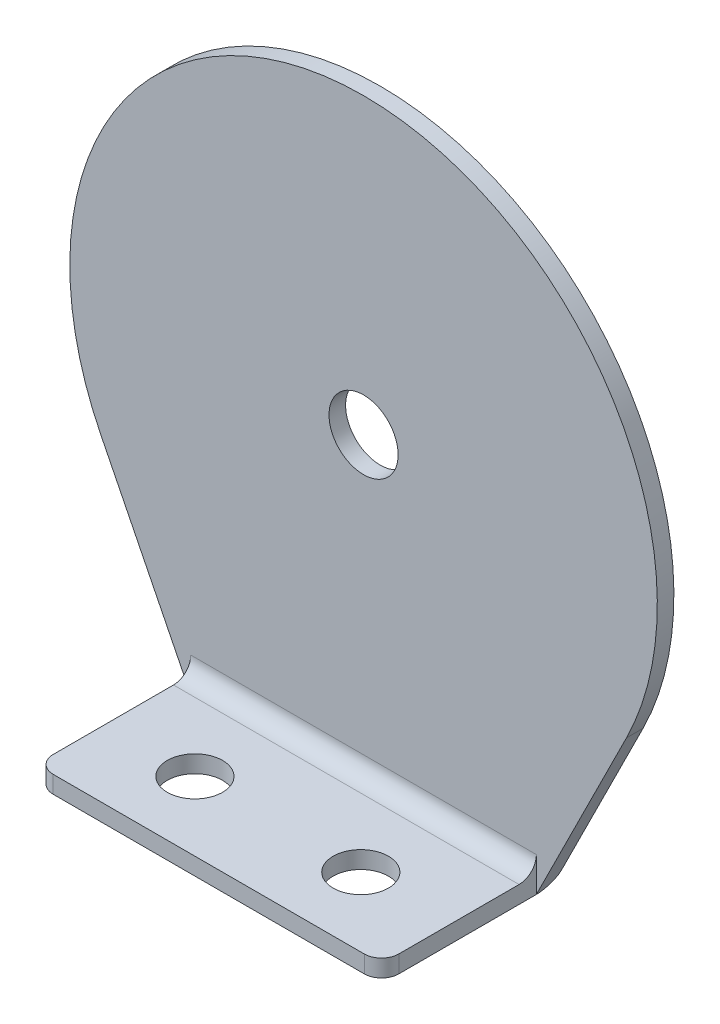
ISO-10303-21;
HEADER;
FILE_DESCRIPTION(('STEP AP214'),'2;1');
FILE_NAME('part.step','',(''),(''),'','','');
FILE_SCHEMA(('AUTOMOTIVE_DESIGN { 1 0 10303 214 1 1 1 1 }'));
ENDSEC;
DATA;
#1=APPLICATION_CONTEXT('core data for automotive mechanical design processes');
#2=APPLICATION_PROTOCOL_DEFINITION('international standard','automotive_design',2000,#1);
#3=PRODUCT_CONTEXT('',#1,'mechanical');
#4=PRODUCT('Part','Part','',(#3));
#5=PRODUCT_RELATED_PRODUCT_CATEGORY('part','',(#4));
#6=PRODUCT_DEFINITION_FORMATION('','',#4);
#7=PRODUCT_DEFINITION_CONTEXT('part definition',#1,'design');
#8=PRODUCT_DEFINITION('design','',#6,#7);
#9=PRODUCT_DEFINITION_SHAPE('','',#8);
#10=(LENGTH_UNIT() NAMED_UNIT(*) SI_UNIT(.MILLI.,.METRE.));
#11=(NAMED_UNIT(*) PLANE_ANGLE_UNIT() SI_UNIT($,.RADIAN.));
#12=(NAMED_UNIT(*) SI_UNIT($,.STERADIAN.) SOLID_ANGLE_UNIT());
#13=UNCERTAINTY_MEASURE_WITH_UNIT(LENGTH_MEASURE(1.E-05),#10,'distance_accuracy_value','');
#14=(GEOMETRIC_REPRESENTATION_CONTEXT(3) GLOBAL_UNCERTAINTY_ASSIGNED_CONTEXT((#13)) GLOBAL_UNIT_ASSIGNED_CONTEXT((#10,
#11,#12)) REPRESENTATION_CONTEXT('',''));
#15=CARTESIAN_POINT('',(0.,0.,0.));
#16=DIRECTION('',(0.,0.,1.));
#17=DIRECTION('',(1.,0.,0.));
#18=AXIS2_PLACEMENT_3D('',#15,#16,#17);
#19=CARTESIAN_POINT('',(0.,28.6385,1.524));
#20=DIRECTION('',(0.,0.,-1.));
#21=DIRECTION('',(-1.,0.,0.));
#22=AXIS2_PLACEMENT_3D('',#19,#20,#21);
#23=CYLINDRICAL_SURFACE('',#22,26.9875);
#24=CARTESIAN_POINT('',(0.,28.6385,0.));
#25=DIRECTION('',(0.,0.,1.));
#26=DIRECTION('',(1.,0.,0.));
#27=AXIS2_PLACEMENT_3D('',#24,#25,#26);
#28=CIRCLE('',#27,26.9875);
#29=CARTESIAN_POINT('',(24.1507546518845,16.5941566806455,0.));
#30=VERTEX_POINT('',#29);
#31=CARTESIAN_POINT('',(-24.1507546518845,16.5941566806455,0.));
#32=VERTEX_POINT('',#31);
#33=EDGE_CURVE('E155',#30,#32,#28,.T.);
#34=ORIENTED_EDGE('',*,*,#33,.T.);
#35=DIRECTION('',(0.,0.,-1.));
#36=VECTOR('',#35,1.);
#37=CARTESIAN_POINT('',(-24.1507546518845,16.5941566806455,1.524));
#38=LINE('',#37,#36);
#39=CARTESIAN_POINT('',(-24.1507546518845,16.5941566806455,1.524));
#40=VERTEX_POINT('',#39);
#41=EDGE_CURVE('E135',#40,#32,#38,.T.);
#42=ORIENTED_EDGE('',*,*,#41,.F.);
#43=CARTESIAN_POINT('',(0.,28.6385,1.524));
#44=DIRECTION('',(0.,0.,1.));
#45=DIRECTION('',(1.,0.,0.));
#46=AXIS2_PLACEMENT_3D('',#43,#44,#45);
#47=CIRCLE('',#46,26.9875);
#48=CARTESIAN_POINT('',(24.1507546518845,16.5941566806455,1.524));
#49=VERTEX_POINT('',#48);
#50=EDGE_CURVE('E143',#49,#40,#47,.T.);
#51=ORIENTED_EDGE('',*,*,#50,.F.);
#52=DIRECTION('',(0.,0.,-1.));
#53=VECTOR('',#52,1.);
#54=CARTESIAN_POINT('',(24.1507546518845,16.5941566806455,1.524));
#55=LINE('',#54,#53);
#56=EDGE_CURVE('E158',#49,#30,#55,.T.);
#57=ORIENTED_EDGE('',*,*,#56,.T.);
#58=EDGE_LOOP('',(#34,#42,#51,#57));
#59=FACE_BOUND('',#58,.T.);
#60=ADVANCED_FACE('F39',(#59),#23,.T.);
#61=CARTESIAN_POINT('',(-24.1507546518845,16.5941566806455,1.524));
#62=DIRECTION('',(0.894886693909569,0.446293406923743,0.));
#63=DIRECTION('',(-0.446293406923743,0.894886693909569,0.));
#64=AXIS2_PLACEMENT_3D('',#61,#62,#63);
#65=PLANE('',#64);
#66=DIRECTION('',(0.446293406923743,-0.894886693909569,0.));
#67=VECTOR('',#66,1.);
#68=CARTESIAN_POINT('',(-24.1507546518845,16.5941566806455,0.));
#69=LINE('',#68,#67);
#70=CARTESIAN_POINT('',(-16.6667100436438,1.5875,0.));
#71=VERTEX_POINT('',#70);
#72=EDGE_CURVE('E282',#32,#71,#69,.T.);
#73=ORIENTED_EDGE('',*,*,#72,.T.);
#74=CARTESIAN_POINT('',(-16.6667100436438,1.5875,1.5875));
#75=DIRECTION('',(0.894886693909569,0.446293406923743,0.));
#76=DIRECTION('',(0.446293406923743,-0.894886693909569,0.));
#77=AXIS2_PLACEMENT_3D('',#74,#75,#76);
#78=ELLIPSE('',#77,1.773967599255,1.5875);
#79=CARTESIAN_POINT('',(-15.875633621585,0.00127050840680737,1.524));
#80=VERTEX_POINT('',#79);
#81=EDGE_CURVE('E138',#71,#80,#78,.F.);
#82=ORIENTED_EDGE('',*,*,#81,.T.);
#83=DIRECTION('',(0.446293406923743,-0.894886693909569,0.));
#84=VECTOR('',#83,1.);
#85=CARTESIAN_POINT('',(-24.1507546518845,16.5941566806455,1.524));
#86=LINE('',#85,#84);
#87=EDGE_CURVE('E131',#40,#80,#86,.T.);
#88=ORIENTED_EDGE('',*,*,#87,.F.);
#89=ORIENTED_EDGE('',*,*,#41,.T.);
#90=EDGE_LOOP('',(#73,#82,#88,#89));
#91=FACE_BOUND('',#90,.T.);
#92=ADVANCED_FACE('F133',(#91),#65,.F.);
#93=CARTESIAN_POINT('',(-15.875,0.,1.524));
#94=DIRECTION('',(0.,1.,0.));
#95=DIRECTION('',(0.,0.,1.));
#96=AXIS2_PLACEMENT_3D('',#93,#94,#95);
#97=PLANE('',#96);
#98=CARTESIAN_POINT('',(7.62,0.,9.398));
#99=DIRECTION('',(0.,-1.,0.));
#100=DIRECTION('',(0.,0.,-1.));
#101=AXIS2_PLACEMENT_3D('',#98,#99,#100);
#102=CIRCLE('',#101,2.54);
#103=CARTESIAN_POINT('',(7.62,0.,6.858));
#104=VERTEX_POINT('',#103);
#105=EDGE_CURVE('E224',#104,#104,#102,.T.);
#106=ORIENTED_EDGE('',*,*,#105,.F.);
#107=EDGE_LOOP('',(#106));
#108=FACE_BOUND('',#107,.T.);
#109=CARTESIAN_POINT('',(-7.62,0.,9.398));
#110=DIRECTION('',(0.,-1.,0.));
#111=DIRECTION('',(0.,0.,1.));
#112=AXIS2_PLACEMENT_3D('',#109,#110,#111);
#113=CIRCLE('',#112,2.54);
#114=CARTESIAN_POINT('',(-7.62,0.,11.938));
#115=VERTEX_POINT('',#114);
#116=EDGE_CURVE('E232',#115,#115,#113,.T.);
#117=ORIENTED_EDGE('',*,*,#116,.F.);
#118=EDGE_LOOP('',(#117));
#119=FACE_BOUND('',#118,.T.);
#120=DIRECTION('',(1.,0.,0.));
#121=VECTOR('',#120,1.);
#122=CARTESIAN_POINT('',(-15.875,0.,15.748));
#123=LINE('',#122,#121);
#124=CARTESIAN_POINT('',(-14.2875,0.,15.748));
#125=VERTEX_POINT('',#124);
#126=CARTESIAN_POINT('',(14.2875,0.,15.748));
#127=VERTEX_POINT('',#126);
#128=EDGE_CURVE('E240',#125,#127,#123,.T.);
#129=ORIENTED_EDGE('',*,*,#128,.F.);
#130=CARTESIAN_POINT('',(-14.2875,0.,14.1605));
#131=DIRECTION('',(0.,1.,0.));
#132=DIRECTION('',(0.,0.,1.));
#133=AXIS2_PLACEMENT_3D('',#130,#131,#132);
#134=CIRCLE('',#133,1.5875);
#135=CARTESIAN_POINT('',(-15.875,0.,14.1605));
#136=VERTEX_POINT('',#135);
#137=EDGE_CURVE('E178',#125,#136,#134,.F.);
#138=ORIENTED_EDGE('',*,*,#137,.T.);
#139=DIRECTION('',(0.,0.,-1.));
#140=VECTOR('',#139,1.);
#141=CARTESIAN_POINT('',(-15.875,0.,15.748));
#142=LINE('',#141,#140);
#143=CARTESIAN_POINT('',(-15.875,0.,1.5875));
#144=VERTEX_POINT('',#143);
#145=EDGE_CURVE('E266',#136,#144,#142,.T.);
#146=ORIENTED_EDGE('',*,*,#145,.T.);
#147=DIRECTION('',(1.,0.,0.));
#148=VECTOR('',#147,1.);
#149=CARTESIAN_POINT('',(-15.875,0.,1.5875));
#150=LINE('',#149,#148);
#151=CARTESIAN_POINT('',(15.875,0.,1.5875));
#152=VERTEX_POINT('',#151);
#153=EDGE_CURVE('E171',#144,#152,#150,.T.);
#154=ORIENTED_EDGE('',*,*,#153,.T.);
#155=DIRECTION('',(0.,0.,-1.));
#156=VECTOR('',#155,1.);
#157=CARTESIAN_POINT('',(15.875,0.,15.748));
#158=LINE('',#157,#156);
#159=CARTESIAN_POINT('',(15.875,0.,14.1605));
#160=VERTEX_POINT('',#159);
#161=EDGE_CURVE('E262',#160,#152,#158,.T.);
#162=ORIENTED_EDGE('',*,*,#161,.F.);
#163=CARTESIAN_POINT('',(14.2875,0.,14.1605));
#164=DIRECTION('',(0.,1.,0.));
#165=DIRECTION('',(0.,0.,1.));
#166=AXIS2_PLACEMENT_3D('',#163,#164,#165);
#167=CIRCLE('',#166,1.5875);
#168=EDGE_CURVE('E175',#160,#127,#167,.F.);
#169=ORIENTED_EDGE('',*,*,#168,.T.);
#170=EDGE_LOOP('',(#129,#138,#146,#154,#162,#169));
#171=FACE_BOUND('',#170,.T.);
#172=ADVANCED_FACE('F305',(#108,#119,#171),#97,.F.);
#173=CARTESIAN_POINT('',(24.1507546518845,16.5941566806455,1.524));
#174=DIRECTION('',(-0.894886693909569,0.446293406923743,0.));
#175=DIRECTION('',(-0.446293406923743,-0.894886693909569,0.));
#176=AXIS2_PLACEMENT_3D('',#173,#174,#175);
#177=PLANE('',#176);
#178=DIRECTION('',(0.446293406923743,0.894886693909569,0.));
#179=VECTOR('',#178,1.);
#180=CARTESIAN_POINT('',(24.1507546518845,16.5941566806455,1.524));
#181=LINE('',#180,#179);
#182=CARTESIAN_POINT('',(15.875633621585,0.00127050840680737,1.524));
#183=VERTEX_POINT('',#182);
#184=EDGE_CURVE('E142',#183,#49,#181,.T.);
#185=ORIENTED_EDGE('',*,*,#184,.F.);
#186=CARTESIAN_POINT('',(16.6667100436438,1.5875,1.5875));
#187=DIRECTION('',(-0.894886693909569,0.446293406923743,0.));
#188=DIRECTION('',(0.446293406923743,0.894886693909569,0.));
#189=AXIS2_PLACEMENT_3D('',#186,#187,#188);
#190=ELLIPSE('',#189,1.773967599255,1.5875);
#191=CARTESIAN_POINT('',(16.6667100436438,1.5875,0.));
#192=VERTEX_POINT('',#191);
#193=EDGE_CURVE('E65',#183,#192,#190,.F.);
#194=ORIENTED_EDGE('',*,*,#193,.T.);
#195=DIRECTION('',(0.446293406923743,0.894886693909569,0.));
#196=VECTOR('',#195,1.);
#197=CARTESIAN_POINT('',(24.1507546518845,16.5941566806455,0.));
#198=LINE('',#197,#196);
#199=EDGE_CURVE('E152',#192,#30,#198,.T.);
#200=ORIENTED_EDGE('',*,*,#199,.T.);
#201=ORIENTED_EDGE('',*,*,#56,.F.);
#202=EDGE_LOOP('',(#185,#194,#200,#201));
#203=FACE_BOUND('',#202,.T.);
#204=ADVANCED_FACE('F285',(#203),#177,.F.);
#205=CARTESIAN_POINT('',(0.,28.6385,1.524));
#206=DIRECTION('',(0.,0.,1.));
#207=DIRECTION('',(1.,0.,0.));
#208=AXIS2_PLACEMENT_3D('',#205,#206,#207);
#209=PLANE('',#208);
#210=DIRECTION('',(0.,-1.,0.));
#211=VECTOR('',#210,1.);
#212=CARTESIAN_POINT('',(-15.875,0.,1.524));
#213=LINE('',#212,#211);
#214=CARTESIAN_POINT('',(-15.875,3.175,1.524));
#215=VERTEX_POINT('',#214);
#216=CARTESIAN_POINT('',(-15.875,0.00127050840680672,1.524));
#217=VERTEX_POINT('',#216);
#218=EDGE_CURVE('E230',#215,#217,#213,.T.);
#219=ORIENTED_EDGE('',*,*,#218,.F.);
#220=DIRECTION('',(-1.,0.,0.));
#221=VECTOR('',#220,1.);
#222=CARTESIAN_POINT('',(0.,3.175,1.524));
#223=LINE('',#222,#221);
#224=CARTESIAN_POINT('',(15.875,3.175,1.524));
#225=VERTEX_POINT('',#224);
#226=EDGE_CURVE('E209',#215,#225,#223,.F.);
#227=ORIENTED_EDGE('',*,*,#226,.T.);
#228=DIRECTION('',(0.,1.,0.));
#229=VECTOR('',#228,1.);
#230=CARTESIAN_POINT('',(15.875,0.,1.524));
#231=LINE('',#230,#229);
#232=CARTESIAN_POINT('',(15.875,0.00127050840680672,1.524));
#233=VERTEX_POINT('',#232);
#234=EDGE_CURVE('E245',#233,#225,#231,.T.);
#235=ORIENTED_EDGE('',*,*,#234,.F.);
#236=DIRECTION('',(1.,0.,0.));
#237=VECTOR('',#236,1.);
#238=CARTESIAN_POINT('',(15.875,0.00127050840680672,1.524));
#239=LINE('',#238,#237);
#240=EDGE_CURVE('E206',#233,#183,#239,.T.);
#241=ORIENTED_EDGE('',*,*,#240,.T.);
#242=ORIENTED_EDGE('',*,*,#184,.T.);
#243=ORIENTED_EDGE('',*,*,#50,.T.);
#244=ORIENTED_EDGE('',*,*,#87,.T.);
#245=DIRECTION('',(1.,0.,0.));
#246=VECTOR('',#245,1.);
#247=CARTESIAN_POINT('',(-15.875633621585,0.00127050840680737,1.524));
#248=LINE('',#247,#246);
#249=EDGE_CURVE('E203',#80,#217,#248,.T.);
#250=ORIENTED_EDGE('',*,*,#249,.T.);
#251=EDGE_LOOP('',(#219,#227,#235,#241,#242,#243,#244,#250));
#252=FACE_BOUND('',#251,.T.);
#253=CARTESIAN_POINT('',(0.,28.6385,1.524));
#254=DIRECTION('',(0.,0.,1.));
#255=DIRECTION('',(1.,0.,0.));
#256=AXIS2_PLACEMENT_3D('',#253,#254,#255);
#257=CIRCLE('',#256,3.175);
#258=CARTESIAN_POINT('',(3.175,28.6385,1.524));
#259=VERTEX_POINT('',#258);
#260=EDGE_CURVE('E270',#259,#259,#257,.T.);
#261=ORIENTED_EDGE('',*,*,#260,.F.);
#262=EDGE_LOOP('',(#261));
#263=FACE_BOUND('',#262,.T.);
#264=ADVANCED_FACE('F146',(#252,#263),#209,.T.);
#265=CARTESIAN_POINT('',(0.,28.6385,0.));
#266=DIRECTION('',(0.,0.,1.));
#267=DIRECTION('',(1.,0.,0.));
#268=AXIS2_PLACEMENT_3D('',#265,#266,#267);
#269=PLANE('',#268);
#270=CARTESIAN_POINT('',(0.,28.6385,0.));
#271=DIRECTION('',(0.,0.,1.));
#272=DIRECTION('',(1.,0.,0.));
#273=AXIS2_PLACEMENT_3D('',#270,#271,#272);
#274=CIRCLE('',#273,3.175);
#275=CARTESIAN_POINT('',(3.175,28.6385,0.));
#276=VERTEX_POINT('',#275);
#277=EDGE_CURVE('E271',#276,#276,#274,.T.);
#278=ORIENTED_EDGE('',*,*,#277,.T.);
#279=EDGE_LOOP('',(#278));
#280=FACE_BOUND('',#279,.T.);
#281=ORIENTED_EDGE('',*,*,#199,.F.);
#282=DIRECTION('',(1.,0.,0.));
#283=VECTOR('',#282,1.);
#284=CARTESIAN_POINT('',(0.,1.5875,0.));
#285=LINE('',#284,#283);
#286=EDGE_CURVE('E57',#192,#71,#285,.F.);
#287=ORIENTED_EDGE('',*,*,#286,.T.);
#288=ORIENTED_EDGE('',*,*,#72,.F.);
#289=ORIENTED_EDGE('',*,*,#33,.F.);
#290=EDGE_LOOP('',(#281,#287,#288,#289));
#291=FACE_BOUND('',#290,.T.);
#292=ADVANCED_FACE('F286',(#280,#291),#269,.F.);
#293=CARTESIAN_POINT('',(0.,28.6385,0.));
#294=DIRECTION('',(0.,0.,1.));
#295=DIRECTION('',(1.,0.,0.));
#296=AXIS2_PLACEMENT_3D('',#293,#294,#295);
#297=CYLINDRICAL_SURFACE('',#296,3.175);
#298=CARTESIAN_POINT('',(3.175,28.6385,0.));
#299=CARTESIAN_POINT('',(3.175,28.6385,0.015875));
#300=CARTESIAN_POINT('',(3.175,28.6385,0.03175));
#301=CARTESIAN_POINT('',(3.175,28.6385,0.0635));
#302=CARTESIAN_POINT('',(3.175,28.6385,0.079375));
#303=CARTESIAN_POINT('',(3.175,28.6385,0.111125));
#304=CARTESIAN_POINT('',(3.175,28.6385,0.127));
#305=CARTESIAN_POINT('',(3.175,28.6385,0.15875));
#306=CARTESIAN_POINT('',(3.175,28.6385,0.174625));
#307=CARTESIAN_POINT('',(3.175,28.6385,0.206375));
#308=CARTESIAN_POINT('',(3.175,28.6385,0.22225));
#309=CARTESIAN_POINT('',(3.175,28.6385,0.254));
#310=CARTESIAN_POINT('',(3.175,28.6385,0.269875));
#311=CARTESIAN_POINT('',(3.175,28.6385,0.301625));
#312=CARTESIAN_POINT('',(3.175,28.6385,0.3175));
#313=CARTESIAN_POINT('',(3.175,28.6385,0.34925));
#314=CARTESIAN_POINT('',(3.175,28.6385,0.365125));
#315=CARTESIAN_POINT('',(3.175,28.6385,0.396875));
#316=CARTESIAN_POINT('',(3.175,28.6385,0.41275));
#317=CARTESIAN_POINT('',(3.175,28.6385,0.4445));
#318=CARTESIAN_POINT('',(3.175,28.6385,0.460375));
#319=CARTESIAN_POINT('',(3.175,28.6385,0.492125));
#320=CARTESIAN_POINT('',(3.175,28.6385,0.508));
#321=CARTESIAN_POINT('',(3.175,28.6385,0.53975));
#322=CARTESIAN_POINT('',(3.175,28.6385,0.555625));
#323=CARTESIAN_POINT('',(3.175,28.6385,0.587375));
#324=CARTESIAN_POINT('',(3.175,28.6385,0.60325));
#325=CARTESIAN_POINT('',(3.175,28.6385,0.635));
#326=CARTESIAN_POINT('',(3.175,28.6385,0.650875));
#327=CARTESIAN_POINT('',(3.175,28.6385,0.682625));
#328=CARTESIAN_POINT('',(3.175,28.6385,0.6985));
#329=CARTESIAN_POINT('',(3.175,28.6385,0.73025));
#330=CARTESIAN_POINT('',(3.175,28.6385,0.746125));
#331=CARTESIAN_POINT('',(3.175,28.6385,0.777875));
#332=CARTESIAN_POINT('',(3.175,28.6385,0.79375));
#333=CARTESIAN_POINT('',(3.175,28.6385,0.8255));
#334=CARTESIAN_POINT('',(3.175,28.6385,0.841375));
#335=CARTESIAN_POINT('',(3.175,28.6385,0.873125));
#336=CARTESIAN_POINT('',(3.175,28.6385,0.889));
#337=CARTESIAN_POINT('',(3.175,28.6385,0.92075));
#338=CARTESIAN_POINT('',(3.175,28.6385,0.936625));
#339=CARTESIAN_POINT('',(3.175,28.6385,0.968375));
#340=CARTESIAN_POINT('',(3.175,28.6385,0.98425));
#341=CARTESIAN_POINT('',(3.175,28.6385,1.016));
#342=CARTESIAN_POINT('',(3.175,28.6385,1.031875));
#343=CARTESIAN_POINT('',(3.175,28.6385,1.063625));
#344=CARTESIAN_POINT('',(3.175,28.6385,1.0795));
#345=CARTESIAN_POINT('',(3.175,28.6385,1.11125));
#346=CARTESIAN_POINT('',(3.175,28.6385,1.127125));
#347=CARTESIAN_POINT('',(3.175,28.6385,1.158875));
#348=CARTESIAN_POINT('',(3.175,28.6385,1.17475));
#349=CARTESIAN_POINT('',(3.175,28.6385,1.2065));
#350=CARTESIAN_POINT('',(3.175,28.6385,1.222375));
#351=CARTESIAN_POINT('',(3.175,28.6385,1.254125));
#352=CARTESIAN_POINT('',(3.175,28.6385,1.27));
#353=CARTESIAN_POINT('',(3.175,28.6385,1.30175));
#354=CARTESIAN_POINT('',(3.175,28.6385,1.317625));
#355=CARTESIAN_POINT('',(3.175,28.6385,1.349375));
#356=CARTESIAN_POINT('',(3.175,28.6385,1.36525));
#357=CARTESIAN_POINT('',(3.175,28.6385,1.397));
#358=CARTESIAN_POINT('',(3.175,28.6385,1.412875));
#359=CARTESIAN_POINT('',(3.175,28.6385,1.444625));
#360=CARTESIAN_POINT('',(3.175,28.6385,1.4605));
#361=CARTESIAN_POINT('',(3.175,28.6385,1.49225));
#362=CARTESIAN_POINT('',(3.175,28.6385,1.508125));
#363=CARTESIAN_POINT('',(3.175,28.6385,1.524));
#364=B_SPLINE_CURVE_WITH_KNOTS('',3,(#298,#299,#300,#301,#302,#303,#304,#305,#306,#307,#308,
#309,#310,#311,#312,#313,#314,#315,#316,#317,#318,#319,#320,#321,#322,#323,#324,#325,#326,#327,
#328,#329,#330,#331,#332,#333,#334,#335,#336,#337,#338,#339,#340,#341,#342,#343,#344,#345,#346,
#347,#348,#349,#350,#351,#352,#353,#354,#355,#356,#357,#358,#359,#360,#361,#362,#363),
.UNSPECIFIED.,.F.,.F.,(4,2,2,2,2,2,2,2,2,2,2,2,2,2,2,2,2,2,2,2,2,2,2,2,2,2,2,2,2,2,2,2,4),(0.,
0.047625,0.09525,0.142875,0.1905,0.238125,0.28575,0.333375,0.381,0.428625,0.47625,0.523875,
0.5715,0.619125,0.66675,0.714375,0.762,0.809625,0.85725,0.904875,0.9525,1.000125,1.04775,
1.095375,1.143,1.190625,1.23825,1.285875,1.3335,1.381125,1.42875,1.476375,1.524),.UNSPECIFIED.);
#365=EDGE_CURVE('BSEAM370',#276,#259,#364,.T.);
#366=ORIENTED_EDGE('',*,*,#277,.F.);
#367=ORIENTED_EDGE('',*,*,#260,.T.);
#368=ORIENTED_EDGE('',*,*,#365,.T.);
#369=ORIENTED_EDGE('',*,*,#365,.F.);
#370=EDGE_LOOP('',(#366,#368,#367,#369));
#371=FACE_BOUND('',#370,.T.);
#372=ADVANCED_FACE('F370',(#371),#297,.F.);
#373=CARTESIAN_POINT('',(-15.875,0.,15.748));
#374=DIRECTION('',(1.,0.,0.));
#375=DIRECTION('',(0.,0.,-1.));
#376=AXIS2_PLACEMENT_3D('',#373,#374,#375);
#377=PLANE('',#376);
#378=ORIENTED_EDGE('',*,*,#145,.F.);
#379=DIRECTION('',(0.,-1.,0.));
#380=VECTOR('',#379,1.);
#381=CARTESIAN_POINT('',(-15.875,0.,14.1605));
#382=LINE('',#381,#380);
#383=CARTESIAN_POINT('',(-15.875,1.5875,14.1605));
#384=VERTEX_POINT('',#383);
#385=EDGE_CURVE('E184',#136,#384,#382,.F.);
#386=ORIENTED_EDGE('',*,*,#385,.T.);
#387=DIRECTION('',(0.,0.,-1.));
#388=VECTOR('',#387,1.);
#389=CARTESIAN_POINT('',(-15.875,1.5875,15.748));
#390=LINE('',#389,#388);
#391=CARTESIAN_POINT('',(-15.875,1.5875,3.1115));
#392=VERTEX_POINT('',#391);
#393=EDGE_CURVE('E249',#384,#392,#390,.T.);
#394=ORIENTED_EDGE('',*,*,#393,.T.);
#395=CARTESIAN_POINT('',(-15.875,3.175,3.1115));
#396=DIRECTION('',(1.,0.,0.));
#397=DIRECTION('',(0.,0.,-1.));
#398=AXIS2_PLACEMENT_3D('',#395,#396,#397);
#399=CIRCLE('',#398,1.5875);
#400=EDGE_CURVE('E49',#392,#215,#399,.T.);
#401=ORIENTED_EDGE('',*,*,#400,.T.);
#402=ORIENTED_EDGE('',*,*,#218,.T.);
#403=CARTESIAN_POINT('',(-15.875,1.5875,1.5875));
#404=DIRECTION('',(1.,0.,0.));
#405=DIRECTION('',(0.,0.,-1.));
#406=AXIS2_PLACEMENT_3D('',#403,#404,#405);
#407=CIRCLE('',#406,1.5875);
#408=EDGE_CURVE('E181',#217,#144,#407,.F.);
#409=ORIENTED_EDGE('',*,*,#408,.T.);
#410=EDGE_LOOP('',(#378,#386,#394,#401,#402,#409));
#411=FACE_BOUND('',#410,.T.);
#412=ADVANCED_FACE('F292',(#411),#377,.F.);
#413=CARTESIAN_POINT('',(15.875,0.,15.748));
#414=DIRECTION('',(-1.,0.,0.));
#415=DIRECTION('',(0.,0.,1.));
#416=AXIS2_PLACEMENT_3D('',#413,#414,#415);
#417=PLANE('',#416);
#418=DIRECTION('',(0.,0.,-1.));
#419=VECTOR('',#418,1.);
#420=CARTESIAN_POINT('',(15.875,1.5875,15.748));
#421=LINE('',#420,#419);
#422=CARTESIAN_POINT('',(15.875,1.5875,14.1605));
#423=VERTEX_POINT('',#422);
#424=CARTESIAN_POINT('',(15.875,1.5875,3.1115));
#425=VERTEX_POINT('',#424);
#426=EDGE_CURVE('E258',#423,#425,#421,.T.);
#427=ORIENTED_EDGE('',*,*,#426,.F.);
#428=DIRECTION('',(0.,1.,0.));
#429=VECTOR('',#428,1.);
#430=CARTESIAN_POINT('',(15.875,0.,14.1605));
#431=LINE('',#430,#429);
#432=EDGE_CURVE('E200',#423,#160,#431,.F.);
#433=ORIENTED_EDGE('',*,*,#432,.T.);
#434=ORIENTED_EDGE('',*,*,#161,.T.);
#435=CARTESIAN_POINT('',(15.875,1.5875,1.5875));
#436=DIRECTION('',(-1.,0.,0.));
#437=DIRECTION('',(0.,0.,1.));
#438=AXIS2_PLACEMENT_3D('',#435,#436,#437);
#439=CIRCLE('',#438,1.5875);
#440=EDGE_CURVE('E197',#152,#233,#439,.F.);
#441=ORIENTED_EDGE('',*,*,#440,.T.);
#442=ORIENTED_EDGE('',*,*,#234,.T.);
#443=CARTESIAN_POINT('',(15.875,3.175,3.1115));
#444=DIRECTION('',(-1.,0.,0.));
#445=DIRECTION('',(0.,0.,1.));
#446=AXIS2_PLACEMENT_3D('',#443,#444,#445);
#447=CIRCLE('',#446,1.5875);
#448=EDGE_CURVE('E11',#225,#425,#447,.T.);
#449=ORIENTED_EDGE('',*,*,#448,.T.);
#450=EDGE_LOOP('',(#427,#433,#434,#441,#442,#449));
#451=FACE_BOUND('',#450,.T.);
#452=ADVANCED_FACE('F308',(#451),#417,.F.);
#453=CARTESIAN_POINT('',(-15.875,1.5875,15.748));
#454=DIRECTION('',(0.,-1.,0.));
#455=DIRECTION('',(0.,0.,-1.));
#456=AXIS2_PLACEMENT_3D('',#453,#454,#455);
#457=PLANE('',#456);
#458=CARTESIAN_POINT('',(7.62,1.5875,9.398));
#459=DIRECTION('',(0.,-1.,0.));
#460=DIRECTION('',(0.,0.,-1.));
#461=AXIS2_PLACEMENT_3D('',#458,#459,#460);
#462=CIRCLE('',#461,2.54);
#463=CARTESIAN_POINT('',(7.62,1.5875,6.858));
#464=VERTEX_POINT('',#463);
#465=EDGE_CURVE('E43',#464,#464,#462,.T.);
#466=ORIENTED_EDGE('',*,*,#465,.T.);
#467=EDGE_LOOP('',(#466));
#468=FACE_BOUND('',#467,.T.);
#469=CARTESIAN_POINT('',(-7.62,1.5875,9.398));
#470=DIRECTION('',(0.,-1.,0.));
#471=DIRECTION('',(0.,0.,-1.));
#472=AXIS2_PLACEMENT_3D('',#469,#470,#471);
#473=CIRCLE('',#472,2.54);
#474=CARTESIAN_POINT('',(-7.62,1.5875,6.858));
#475=VERTEX_POINT('',#474);
#476=EDGE_CURVE('E221',#475,#475,#473,.T.);
#477=ORIENTED_EDGE('',*,*,#476,.T.);
#478=EDGE_LOOP('',(#477));
#479=FACE_BOUND('',#478,.T.);
#480=ORIENTED_EDGE('',*,*,#393,.F.);
#481=CARTESIAN_POINT('',(-14.2875,1.5875,14.1605));
#482=DIRECTION('',(0.,-1.,0.));
#483=DIRECTION('',(0.,0.,-1.));
#484=AXIS2_PLACEMENT_3D('',#481,#482,#483);
#485=CIRCLE('',#484,1.5875);
#486=CARTESIAN_POINT('',(-14.2875,1.5875,15.748));
#487=VERTEX_POINT('',#486);
#488=EDGE_CURVE('E194',#384,#487,#485,.F.);
#489=ORIENTED_EDGE('',*,*,#488,.T.);
#490=DIRECTION('',(-1.,0.,0.));
#491=VECTOR('',#490,1.);
#492=CARTESIAN_POINT('',(-15.875,1.5875,15.748));
#493=LINE('',#492,#491);
#494=CARTESIAN_POINT('',(14.2875,1.5875,15.748));
#495=VERTEX_POINT('',#494);
#496=EDGE_CURVE('E244',#495,#487,#493,.T.);
#497=ORIENTED_EDGE('',*,*,#496,.F.);
#498=CARTESIAN_POINT('',(14.2875,1.5875,14.1605));
#499=DIRECTION('',(0.,-1.,0.));
#500=DIRECTION('',(0.,0.,-1.));
#501=AXIS2_PLACEMENT_3D('',#498,#499,#500);
#502=CIRCLE('',#501,1.5875);
#503=EDGE_CURVE('E191',#495,#423,#502,.F.);
#504=ORIENTED_EDGE('',*,*,#503,.T.);
#505=ORIENTED_EDGE('',*,*,#426,.T.);
#506=DIRECTION('',(-1.,0.,0.));
#507=VECTOR('',#506,1.);
#508=CARTESIAN_POINT('',(-15.875,1.5875,3.1115));
#509=LINE('',#508,#507);
#510=EDGE_CURVE('E187',#425,#392,#509,.T.);
#511=ORIENTED_EDGE('',*,*,#510,.T.);
#512=EDGE_LOOP('',(#480,#489,#497,#504,#505,#511));
#513=FACE_BOUND('',#512,.T.);
#514=ADVANCED_FACE('F322',(#468,#479,#513),#457,.F.);
#515=CARTESIAN_POINT('',(0.,0.,15.748));
#516=DIRECTION('',(0.,0.,-1.));
#517=DIRECTION('',(-1.,0.,0.));
#518=AXIS2_PLACEMENT_3D('',#515,#516,#517);
#519=PLANE('',#518);
#520=ORIENTED_EDGE('',*,*,#496,.T.);
#521=DIRECTION('',(0.,-1.,0.));
#522=VECTOR('',#521,1.);
#523=CARTESIAN_POINT('',(-14.2875,0.,15.748));
#524=LINE('',#523,#522);
#525=EDGE_CURVE('E163',#487,#125,#524,.T.);
#526=ORIENTED_EDGE('',*,*,#525,.T.);
#527=ORIENTED_EDGE('',*,*,#128,.T.);
#528=DIRECTION('',(0.,1.,0.));
#529=VECTOR('',#528,1.);
#530=CARTESIAN_POINT('',(14.2875,0.,15.748));
#531=LINE('',#530,#529);
#532=EDGE_CURVE('E157',#127,#495,#531,.T.);
#533=ORIENTED_EDGE('',*,*,#532,.T.);
#534=EDGE_LOOP('',(#520,#526,#527,#533));
#535=FACE_BOUND('',#534,.T.);
#536=ADVANCED_FACE('F314',(#535),#519,.F.);
#537=CARTESIAN_POINT('',(-14.2875,0.,14.1605));
#538=DIRECTION('',(0.,-1.,0.));
#539=DIRECTION('',(0.,0.,-1.));
#540=AXIS2_PLACEMENT_3D('',#537,#538,#539);
#541=CYLINDRICAL_SURFACE('',#540,1.5875);
#542=ORIENTED_EDGE('',*,*,#488,.F.);
#543=ORIENTED_EDGE('',*,*,#385,.F.);
#544=ORIENTED_EDGE('',*,*,#137,.F.);
#545=ORIENTED_EDGE('',*,*,#525,.F.);
#546=EDGE_LOOP('',(#542,#543,#544,#545));
#547=FACE_BOUND('',#546,.T.);
#548=ADVANCED_FACE('F319',(#547),#541,.T.);
#549=CARTESIAN_POINT('',(14.2875,0.,14.1605));
#550=DIRECTION('',(0.,1.,0.));
#551=DIRECTION('',(0.,0.,1.));
#552=AXIS2_PLACEMENT_3D('',#549,#550,#551);
#553=CYLINDRICAL_SURFACE('',#552,1.5875);
#554=ORIENTED_EDGE('',*,*,#168,.F.);
#555=ORIENTED_EDGE('',*,*,#432,.F.);
#556=ORIENTED_EDGE('',*,*,#503,.F.);
#557=ORIENTED_EDGE('',*,*,#532,.F.);
#558=EDGE_LOOP('',(#554,#555,#556,#557));
#559=FACE_BOUND('',#558,.T.);
#560=ADVANCED_FACE('F311',(#559),#553,.T.);
#561=CARTESIAN_POINT('',(-15.875,3.175,3.1115));
#562=DIRECTION('',(-1.,0.,0.));
#563=DIRECTION('',(0.,0.,1.));
#564=AXIS2_PLACEMENT_3D('',#561,#562,#563);
#565=CYLINDRICAL_SURFACE('',#564,1.5875);
#566=ORIENTED_EDGE('',*,*,#448,.F.);
#567=ORIENTED_EDGE('',*,*,#226,.F.);
#568=ORIENTED_EDGE('',*,*,#400,.F.);
#569=ORIENTED_EDGE('',*,*,#510,.F.);
#570=EDGE_LOOP('',(#566,#567,#568,#569));
#571=FACE_BOUND('',#570,.T.);
#572=ADVANCED_FACE('F298',(#571),#565,.F.);
#573=CARTESIAN_POINT('',(-15.875,1.5875,1.5875));
#574=DIRECTION('',(1.,0.,0.));
#575=DIRECTION('',(0.,0.,-1.));
#576=AXIS2_PLACEMENT_3D('',#573,#574,#575);
#577=CYLINDRICAL_SURFACE('',#576,1.5875);
#578=ORIENTED_EDGE('',*,*,#81,.F.);
#579=ORIENTED_EDGE('',*,*,#286,.F.);
#580=ORIENTED_EDGE('',*,*,#193,.F.);
#581=ORIENTED_EDGE('',*,*,#240,.F.);
#582=ORIENTED_EDGE('',*,*,#440,.F.);
#583=ORIENTED_EDGE('',*,*,#153,.F.);
#584=ORIENTED_EDGE('',*,*,#408,.F.);
#585=ORIENTED_EDGE('',*,*,#249,.F.);
#586=EDGE_LOOP('',(#578,#579,#580,#581,#582,#583,#584,#585));
#587=FACE_BOUND('',#586,.T.);
#588=ADVANCED_FACE('F41',(#587),#577,.T.);
#589=CARTESIAN_POINT('',(-7.62,55.626,9.398));
#590=DIRECTION('',(0.,-1.,0.));
#591=DIRECTION('',(0.,0.,-1.));
#592=AXIS2_PLACEMENT_3D('',#589,#590,#591);
#593=CYLINDRICAL_SURFACE('',#592,2.54);
#594=ORIENTED_EDGE('',*,*,#116,.T.);
#595=EDGE_LOOP('',(#594));
#596=FACE_BOUND('',#595,.T.);
#597=ORIENTED_EDGE('',*,*,#476,.F.);
#598=EDGE_LOOP('',(#597));
#599=FACE_BOUND('',#598,.T.);
#600=ADVANCED_FACE('F347',(#596,#599),#593,.F.);
#601=CARTESIAN_POINT('',(7.62,55.626,9.398));
#602=DIRECTION('',(0.,-1.,0.));
#603=DIRECTION('',(0.,0.,-1.));
#604=AXIS2_PLACEMENT_3D('',#601,#602,#603);
#605=CYLINDRICAL_SURFACE('',#604,2.54);
#606=ORIENTED_EDGE('',*,*,#105,.T.);
#607=EDGE_LOOP('',(#606));
#608=FACE_BOUND('',#607,.T.);
#609=ORIENTED_EDGE('',*,*,#465,.F.);
#610=EDGE_LOOP('',(#609));
#611=FACE_BOUND('',#610,.T.);
#612=ADVANCED_FACE('F351',(#608,#611),#605,.F.);
#613=CLOSED_SHELL('',(#60,#92,#172,#204,#264,#292,#372,#412,#452,#514,#536,#548,#560,#572,#588,
#600,#612));
#614=MANIFOLD_SOLID_BREP('B2',#613);
#615=ADVANCED_BREP_SHAPE_REPRESENTATION('',(#18,#614),#14);
#616=SHAPE_DEFINITION_REPRESENTATION(#9,#615);
ENDSEC;
END-ISO-10303-21;
